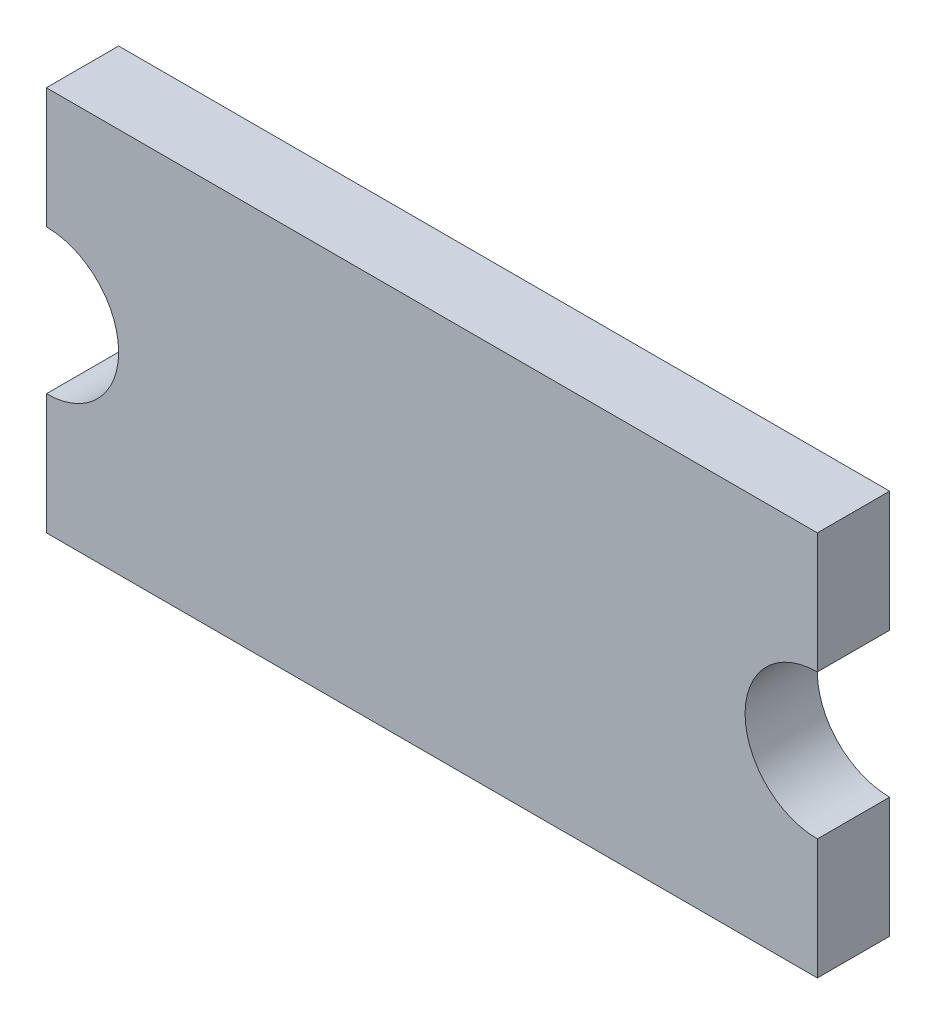
ISO-10303-21;
HEADER;
FILE_DESCRIPTION(('STEP AP214'),'2;1');
FILE_NAME('part.step','',(''),(''),'','','');
FILE_SCHEMA(('AUTOMOTIVE_DESIGN { 1 0 10303 214 1 1 1 1 }'));
ENDSEC;
DATA;
#1=APPLICATION_CONTEXT('core data for automotive mechanical design processes');
#2=APPLICATION_PROTOCOL_DEFINITION('international standard','automotive_design',2000,#1);
#3=PRODUCT_CONTEXT('',#1,'mechanical');
#4=PRODUCT('Part','Part','',(#3));
#5=PRODUCT_RELATED_PRODUCT_CATEGORY('part','',(#4));
#6=PRODUCT_DEFINITION_FORMATION('','',#4);
#7=PRODUCT_DEFINITION_CONTEXT('part definition',#1,'design');
#8=PRODUCT_DEFINITION('design','',#6,#7);
#9=PRODUCT_DEFINITION_SHAPE('','',#8);
#10=(LENGTH_UNIT() NAMED_UNIT(*) SI_UNIT(.MILLI.,.METRE.));
#11=(NAMED_UNIT(*) PLANE_ANGLE_UNIT() SI_UNIT($,.RADIAN.));
#12=(NAMED_UNIT(*) SI_UNIT($,.STERADIAN.) SOLID_ANGLE_UNIT());
#13=UNCERTAINTY_MEASURE_WITH_UNIT(LENGTH_MEASURE(1.E-05),#10,'distance_accuracy_value','');
#14=(GEOMETRIC_REPRESENTATION_CONTEXT(3) GLOBAL_UNCERTAINTY_ASSIGNED_CONTEXT((#13)) GLOBAL_UNIT_ASSIGNED_CONTEXT((#10,
#11,#12)) REPRESENTATION_CONTEXT('',''));
#15=CARTESIAN_POINT('',(0.,0.,0.));
#16=DIRECTION('',(0.,0.,1.));
#17=DIRECTION('',(1.,0.,0.));
#18=AXIS2_PLACEMENT_3D('',#15,#16,#17);
#19=CARTESIAN_POINT('',(15.452683353424,-4.498529243469,1.578573005645E-08));
#20=DIRECTION('',(0.,1.,0.));
#21=DIRECTION('',(1.,0.,0.));
#22=AXIS2_PLACEMENT_3D('',#19,#20,#21);
#23=PLANE('',#22);
#24=DIRECTION('',(0.,0.,1.));
#25=VECTOR('',#24,1.);
#26=CARTESIAN_POINT('',(15.452683353424,-4.498529243469,1.578573005645E-08));
#27=LINE('',#26,#25);
#28=CARTESIAN_POINT('',(15.452683353424,-4.498529243469,1.578573005645E-08));
#29=VERTEX_POINT('',#28);
#30=CARTESIAN_POINT('',(15.452683353424,-4.498529243469,0.150000015786));
#31=VERTEX_POINT('',#30);
#32=EDGE_CURVE('E145',#29,#31,#27,.T.);
#33=ORIENTED_EDGE('',*,*,#32,.T.);
#34=DIRECTION('',(1.,0.,0.));
#35=VECTOR('',#34,1.);
#36=CARTESIAN_POINT('',(15.452683353424,-4.498529243469,0.150000015786));
#37=LINE('',#36,#35);
#38=CARTESIAN_POINT('',(17.052683353424,-4.498529243469,0.150000015786));
#39=VERTEX_POINT('',#38);
#40=EDGE_CURVE('E119',#31,#39,#37,.T.);
#41=ORIENTED_EDGE('',*,*,#40,.T.);
#42=DIRECTION('',(0.,0.,1.));
#43=VECTOR('',#42,1.);
#44=CARTESIAN_POINT('',(17.052683353424,-4.498529243469,1.578573005645E-08));
#45=LINE('',#44,#43);
#46=CARTESIAN_POINT('',(17.052683353424,-4.498529243469,1.578573005645E-08));
#47=VERTEX_POINT('',#46);
#48=EDGE_CURVE('E118',#47,#39,#45,.T.);
#49=ORIENTED_EDGE('',*,*,#48,.F.);
#50=DIRECTION('',(1.,0.,0.));
#51=VECTOR('',#50,1.);
#52=CARTESIAN_POINT('',(15.452683353424,-4.498529243469,1.578573005645E-08));
#53=LINE('',#52,#51);
#54=EDGE_CURVE('E20',#29,#47,#53,.T.);
#55=ORIENTED_EDGE('',*,*,#54,.F.);
#56=EDGE_LOOP('',(#33,#41,#49,#55));
#57=FACE_BOUND('',#56,.T.);
#58=ADVANCED_FACE('F16',(#57),#23,.T.);
#59=CARTESIAN_POINT('',(15.452683353424,-5.298529243469,1.578573005645E-08));
#60=DIRECTION('',(-1.,0.,0.));
#61=DIRECTION('',(0.,0.,1.));
#62=AXIS2_PLACEMENT_3D('',#59,#60,#61);
#63=PLANE('',#62);
#64=DIRECTION('',(0.,1.,0.));
#65=VECTOR('',#64,1.);
#66=CARTESIAN_POINT('',(15.452683353424,-5.298529243469,1.578573005645E-08));
#67=LINE('',#66,#65);
#68=CARTESIAN_POINT('',(15.452683353424,-4.748529243469,1.578573005645E-08));
#69=VERTEX_POINT('',#68);
#70=EDGE_CURVE('E112',#69,#29,#67,.T.);
#71=ORIENTED_EDGE('',*,*,#70,.F.);
#72=DIRECTION('',(0.,0.,1.));
#73=VECTOR('',#72,1.);
#74=CARTESIAN_POINT('',(15.452683353424,-4.748529243469,0.150000015786));
#75=LINE('',#74,#73);
#76=CARTESIAN_POINT('',(15.452683353424,-4.748529243469,0.150000015786));
#77=VERTEX_POINT('',#76);
#78=EDGE_CURVE('E138',#69,#77,#75,.T.);
#79=ORIENTED_EDGE('',*,*,#78,.T.);
#80=DIRECTION('',(0.,1.,0.));
#81=VECTOR('',#80,1.);
#82=CARTESIAN_POINT('',(15.452683353424,-5.298529243469,0.150000015786));
#83=LINE('',#82,#81);
#84=EDGE_CURVE('E125',#77,#31,#83,.T.);
#85=ORIENTED_EDGE('',*,*,#84,.T.);
#86=ORIENTED_EDGE('',*,*,#32,.F.);
#87=EDGE_LOOP('',(#71,#79,#85,#86));
#88=FACE_BOUND('',#87,.T.);
#89=ADVANCED_FACE('F227',(#88),#63,.T.);
#90=CARTESIAN_POINT('',(17.052683353424,-4.498529243469,1.578573005645E-08));
#91=DIRECTION('',(1.,0.,0.));
#92=DIRECTION('',(0.,1.,0.));
#93=AXIS2_PLACEMENT_3D('',#90,#91,#92);
#94=PLANE('',#93);
#95=DIRECTION('',(0.,-1.,0.));
#96=VECTOR('',#95,1.);
#97=CARTESIAN_POINT('',(17.052683353424,-4.498529243469,1.578573005645E-08));
#98=LINE('',#97,#96);
#99=CARTESIAN_POINT('',(17.052683353424,-4.748529243469,1.578573005645E-08));
#100=VERTEX_POINT('',#99);
#101=EDGE_CURVE('E109',#47,#100,#98,.T.);
#102=ORIENTED_EDGE('',*,*,#101,.F.);
#103=ORIENTED_EDGE('',*,*,#48,.T.);
#104=DIRECTION('',(0.,-1.,0.));
#105=VECTOR('',#104,1.);
#106=CARTESIAN_POINT('',(17.052683353424,-4.498529243469,0.150000015786));
#107=LINE('',#106,#105);
#108=CARTESIAN_POINT('',(17.052683353424,-4.748529243469,0.150000015786));
#109=VERTEX_POINT('',#108);
#110=EDGE_CURVE('E124',#39,#109,#107,.T.);
#111=ORIENTED_EDGE('',*,*,#110,.T.);
#112=DIRECTION('',(0.,0.,1.));
#113=VECTOR('',#112,1.);
#114=CARTESIAN_POINT('',(17.052683353424,-4.748529243469,0.150000015786));
#115=LINE('',#114,#113);
#116=EDGE_CURVE('E128',#100,#109,#115,.T.);
#117=ORIENTED_EDGE('',*,*,#116,.F.);
#118=EDGE_LOOP('',(#102,#103,#111,#117));
#119=FACE_BOUND('',#118,.T.);
#120=ADVANCED_FACE('F127',(#119),#94,.T.);
#121=CARTESIAN_POINT('',(16.252683353424,-4.898529243469,1.578573005645E-08));
#122=DIRECTION('',(0.,0.,-1.));
#123=DIRECTION('',(0.,-1.,0.));
#124=AXIS2_PLACEMENT_3D('',#121,#122,#123);
#125=PLANE('',#124);
#126=ORIENTED_EDGE('',*,*,#70,.T.);
#127=ORIENTED_EDGE('',*,*,#54,.T.);
#128=ORIENTED_EDGE('',*,*,#101,.T.);
#129=CARTESIAN_POINT('',(17.052683353424,-4.898529243469,1.578573005645E-08));
#130=DIRECTION('',(0.,0.,1.));
#131=DIRECTION('',(1.,0.,0.));
#132=AXIS2_PLACEMENT_3D('',#129,#130,#131);
#133=CIRCLE('',#132,0.15);
#134=CARTESIAN_POINT('',(17.052683353424,-5.048529243469,1.578573005645E-08));
#135=VERTEX_POINT('',#134);
#136=EDGE_CURVE('E130',#100,#135,#133,.T.);
#137=ORIENTED_EDGE('',*,*,#136,.T.);
#138=DIRECTION('',(0.,-1.,0.));
#139=VECTOR('',#138,1.);
#140=CARTESIAN_POINT('',(17.052683353424,-4.498529243469,1.578573005645E-08));
#141=LINE('',#140,#139);
#142=CARTESIAN_POINT('',(17.052683353424,-5.298529243469,1.578573005645E-08));
#143=VERTEX_POINT('',#142);
#144=EDGE_CURVE('E134',#135,#143,#141,.T.);
#145=ORIENTED_EDGE('',*,*,#144,.T.);
#146=DIRECTION('',(-1.,0.,0.));
#147=VECTOR('',#146,1.);
#148=CARTESIAN_POINT('',(17.052683353424,-5.298529243469,1.578573005645E-08));
#149=LINE('',#148,#147);
#150=CARTESIAN_POINT('',(15.452683353424,-5.298529243469,1.578573005645E-08));
#151=VERTEX_POINT('',#150);
#152=EDGE_CURVE('E159',#143,#151,#149,.T.);
#153=ORIENTED_EDGE('',*,*,#152,.T.);
#154=DIRECTION('',(0.,1.,0.));
#155=VECTOR('',#154,1.);
#156=CARTESIAN_POINT('',(15.452683353424,-5.298529243469,1.578573005645E-08));
#157=LINE('',#156,#155);
#158=CARTESIAN_POINT('',(15.452683353424,-5.048529243469,1.578573005645E-08));
#159=VERTEX_POINT('',#158);
#160=EDGE_CURVE('E155',#151,#159,#157,.T.);
#161=ORIENTED_EDGE('',*,*,#160,.T.);
#162=CARTESIAN_POINT('',(15.452683353424,-4.898529243469,1.578573005645E-08));
#163=DIRECTION('',(0.,0.,1.));
#164=DIRECTION('',(1.,0.,0.));
#165=AXIS2_PLACEMENT_3D('',#162,#163,#164);
#166=CIRCLE('',#165,0.15);
#167=CARTESIAN_POINT('',(15.602683353424,-4.898529243469,1.578573005645E-08));
#168=VERTEX_POINT('',#167);
#169=EDGE_CURVE('E158',#159,#168,#166,.T.);
#170=ORIENTED_EDGE('',*,*,#169,.T.);
#171=CARTESIAN_POINT('',(15.452683353424,-4.898529243469,1.578573005645E-08));
#172=DIRECTION('',(0.,0.,1.));
#173=DIRECTION('',(1.,0.,0.));
#174=AXIS2_PLACEMENT_3D('',#171,#172,#173);
#175=CIRCLE('',#174,0.15);
#176=EDGE_CURVE('E166',#168,#69,#175,.T.);
#177=ORIENTED_EDGE('',*,*,#176,.T.);
#178=EDGE_LOOP('',(#126,#127,#128,#137,#145,#153,#161,#170,#177));
#179=FACE_BOUND('',#178,.T.);
#180=ADVANCED_FACE('F106',(#179),#125,.T.);
#181=CARTESIAN_POINT('',(16.252683353424,-4.898529243469,0.150000015786));
#182=DIRECTION('',(0.,0.,-1.));
#183=DIRECTION('',(0.,-1.,0.));
#184=AXIS2_PLACEMENT_3D('',#181,#182,#183);
#185=PLANE('',#184);
#186=CARTESIAN_POINT('',(15.452683353424,-4.898529243469,0.150000015786));
#187=DIRECTION('',(0.,0.,1.));
#188=DIRECTION('',(1.,0.,0.));
#189=AXIS2_PLACEMENT_3D('',#186,#187,#188);
#190=CIRCLE('',#189,0.15);
#191=CARTESIAN_POINT('',(15.602683353424,-4.898529243469,0.150000015786));
#192=VERTEX_POINT('',#191);
#193=EDGE_CURVE('E161',#192,#77,#190,.T.);
#194=ORIENTED_EDGE('',*,*,#193,.F.);
#195=CARTESIAN_POINT('',(15.452683353424,-4.898529243469,0.150000015786));
#196=DIRECTION('',(0.,0.,1.));
#197=DIRECTION('',(1.,0.,0.));
#198=AXIS2_PLACEMENT_3D('',#195,#196,#197);
#199=CIRCLE('',#198,0.15);
#200=CARTESIAN_POINT('',(15.452683353424,-5.048529243469,0.150000015786));
#201=VERTEX_POINT('',#200);
#202=EDGE_CURVE('E146',#201,#192,#199,.T.);
#203=ORIENTED_EDGE('',*,*,#202,.F.);
#204=DIRECTION('',(0.,1.,0.));
#205=VECTOR('',#204,1.);
#206=CARTESIAN_POINT('',(15.452683353424,-5.298529243469,0.150000015786));
#207=LINE('',#206,#205);
#208=CARTESIAN_POINT('',(15.452683353424,-5.298529243469,0.150000015786));
#209=VERTEX_POINT('',#208);
#210=EDGE_CURVE('E178',#209,#201,#207,.T.);
#211=ORIENTED_EDGE('',*,*,#210,.F.);
#212=DIRECTION('',(-1.,0.,0.));
#213=VECTOR('',#212,1.);
#214=CARTESIAN_POINT('',(17.052683353424,-5.298529243469,0.150000015786));
#215=LINE('',#214,#213);
#216=CARTESIAN_POINT('',(17.052683353424,-5.298529243469,0.150000015786));
#217=VERTEX_POINT('',#216);
#218=EDGE_CURVE('E184',#217,#209,#215,.T.);
#219=ORIENTED_EDGE('',*,*,#218,.F.);
#220=DIRECTION('',(0.,-1.,0.));
#221=VECTOR('',#220,1.);
#222=CARTESIAN_POINT('',(17.052683353424,-4.498529243469,0.150000015786));
#223=LINE('',#222,#221);
#224=CARTESIAN_POINT('',(17.052683353424,-5.048529243469,0.150000015786));
#225=VERTEX_POINT('',#224);
#226=EDGE_CURVE('E11',#225,#217,#223,.T.);
#227=ORIENTED_EDGE('',*,*,#226,.F.);
#228=CARTESIAN_POINT('',(17.052683353424,-4.898529243469,0.150000015786));
#229=DIRECTION('',(0.,0.,1.));
#230=DIRECTION('',(1.,0.,0.));
#231=AXIS2_PLACEMENT_3D('',#228,#229,#230);
#232=CIRCLE('',#231,0.15);
#233=EDGE_CURVE('E152',#109,#225,#232,.T.);
#234=ORIENTED_EDGE('',*,*,#233,.F.);
#235=ORIENTED_EDGE('',*,*,#110,.F.);
#236=ORIENTED_EDGE('',*,*,#40,.F.);
#237=ORIENTED_EDGE('',*,*,#84,.F.);
#238=EDGE_LOOP('',(#194,#203,#211,#219,#227,#234,#235,#236,#237));
#239=FACE_BOUND('',#238,.T.);
#240=ADVANCED_FACE('F220',(#239),#185,.F.);
#241=CARTESIAN_POINT('',(15.452683353424,-4.898529243469,0.150000015786));
#242=DIRECTION('',(0.,0.,1.));
#243=DIRECTION('',(1.,0.,0.));
#244=AXIS2_PLACEMENT_3D('',#241,#242,#243);
#245=CYLINDRICAL_SURFACE('',#244,0.15);
#246=ORIENTED_EDGE('',*,*,#78,.F.);
#247=ORIENTED_EDGE('',*,*,#176,.F.);
#248=DIRECTION('',(0.,0.,-1.));
#249=VECTOR('',#248,1.);
#250=CARTESIAN_POINT('',(15.602683353424,-4.898529243469,0.150000015786));
#251=LINE('',#250,#249);
#252=EDGE_CURVE('E149',#192,#168,#251,.T.);
#253=ORIENTED_EDGE('',*,*,#252,.F.);
#254=ORIENTED_EDGE('',*,*,#193,.T.);
#255=EDGE_LOOP('',(#246,#247,#253,#254));
#256=FACE_BOUND('',#255,.T.);
#257=ADVANCED_FACE('F239',(#256),#245,.F.);
#258=CARTESIAN_POINT('',(17.052683353424,-4.898529243469,0.150000015786));
#259=DIRECTION('',(0.,0.,1.));
#260=DIRECTION('',(1.,0.,0.));
#261=AXIS2_PLACEMENT_3D('',#258,#259,#260);
#262=CYLINDRICAL_SURFACE('',#261,0.15);
#263=DIRECTION('',(0.,0.,1.));
#264=VECTOR('',#263,1.);
#265=CARTESIAN_POINT('',(17.052683353424,-5.048529243469,0.150000015786));
#266=LINE('',#265,#264);
#267=EDGE_CURVE('E27',#135,#225,#266,.T.);
#268=ORIENTED_EDGE('',*,*,#267,.F.);
#269=ORIENTED_EDGE('',*,*,#136,.F.);
#270=ORIENTED_EDGE('',*,*,#116,.T.);
#271=ORIENTED_EDGE('',*,*,#233,.T.);
#272=EDGE_LOOP('',(#268,#269,#270,#271));
#273=FACE_BOUND('',#272,.T.);
#274=ADVANCED_FACE('F224',(#273),#262,.F.);
#275=CARTESIAN_POINT('',(15.452683353424,-4.898529243469,0.150000015786));
#276=DIRECTION('',(0.,0.,1.));
#277=DIRECTION('',(1.,0.,0.));
#278=AXIS2_PLACEMENT_3D('',#275,#276,#277);
#279=CYLINDRICAL_SURFACE('',#278,0.15);
#280=ORIENTED_EDGE('',*,*,#169,.F.);
#281=DIRECTION('',(0.,0.,1.));
#282=VECTOR('',#281,1.);
#283=CARTESIAN_POINT('',(15.452683353424,-5.048529243469,0.150000015786));
#284=LINE('',#283,#282);
#285=EDGE_CURVE('E150',#159,#201,#284,.T.);
#286=ORIENTED_EDGE('',*,*,#285,.T.);
#287=ORIENTED_EDGE('',*,*,#202,.T.);
#288=ORIENTED_EDGE('',*,*,#252,.T.);
#289=EDGE_LOOP('',(#280,#286,#287,#288));
#290=FACE_BOUND('',#289,.T.);
#291=ADVANCED_FACE('F241',(#290),#279,.F.);
#292=CARTESIAN_POINT('',(15.452683353424,-5.298529243469,1.578573005645E-08));
#293=DIRECTION('',(-1.,0.,0.));
#294=DIRECTION('',(0.,0.,1.));
#295=AXIS2_PLACEMENT_3D('',#292,#293,#294);
#296=PLANE('',#295);
#297=ORIENTED_EDGE('',*,*,#160,.F.);
#298=DIRECTION('',(0.,0.,1.));
#299=VECTOR('',#298,1.);
#300=CARTESIAN_POINT('',(15.452683353424,-5.298529243469,1.578573005645E-08));
#301=LINE('',#300,#299);
#302=EDGE_CURVE('E183',#151,#209,#301,.T.);
#303=ORIENTED_EDGE('',*,*,#302,.T.);
#304=ORIENTED_EDGE('',*,*,#210,.T.);
#305=ORIENTED_EDGE('',*,*,#285,.F.);
#306=EDGE_LOOP('',(#297,#303,#304,#305));
#307=FACE_BOUND('',#306,.T.);
#308=ADVANCED_FACE('F18',(#307),#296,.T.);
#309=CARTESIAN_POINT('',(17.052683353424,-5.298529243469,1.578573005645E-08));
#310=DIRECTION('',(0.,-1.,0.));
#311=DIRECTION('',(0.,0.,-1.));
#312=AXIS2_PLACEMENT_3D('',#309,#310,#311);
#313=PLANE('',#312);
#314=DIRECTION('',(0.,0.,1.));
#315=VECTOR('',#314,1.);
#316=CARTESIAN_POINT('',(17.052683353424,-5.298529243469,1.578573005645E-08));
#317=LINE('',#316,#315);
#318=EDGE_CURVE('E182',#143,#217,#317,.T.);
#319=ORIENTED_EDGE('',*,*,#318,.T.);
#320=ORIENTED_EDGE('',*,*,#218,.T.);
#321=ORIENTED_EDGE('',*,*,#302,.F.);
#322=ORIENTED_EDGE('',*,*,#152,.F.);
#323=EDGE_LOOP('',(#319,#320,#321,#322));
#324=FACE_BOUND('',#323,.T.);
#325=ADVANCED_FACE('F214',(#324),#313,.T.);
#326=CARTESIAN_POINT('',(17.052683353424,-4.498529243469,1.578573005645E-08));
#327=DIRECTION('',(1.,0.,0.));
#328=DIRECTION('',(0.,1.,0.));
#329=AXIS2_PLACEMENT_3D('',#326,#327,#328);
#330=PLANE('',#329);
#331=ORIENTED_EDGE('',*,*,#144,.F.);
#332=ORIENTED_EDGE('',*,*,#267,.T.);
#333=ORIENTED_EDGE('',*,*,#226,.T.);
#334=ORIENTED_EDGE('',*,*,#318,.F.);
#335=EDGE_LOOP('',(#331,#332,#333,#334));
#336=FACE_BOUND('',#335,.T.);
#337=ADVANCED_FACE('F218',(#336),#330,.T.);
#338=CLOSED_SHELL('',(#58,#89,#120,#180,#240,#257,#274,#291,#308,#325,#337));
#339=MANIFOLD_SOLID_BREP('B1',#338);
#340=ADVANCED_BREP_SHAPE_REPRESENTATION('',(#18,#339),#14);
#341=SHAPE_DEFINITION_REPRESENTATION(#9,#340);
ENDSEC;
END-ISO-10303-21;
